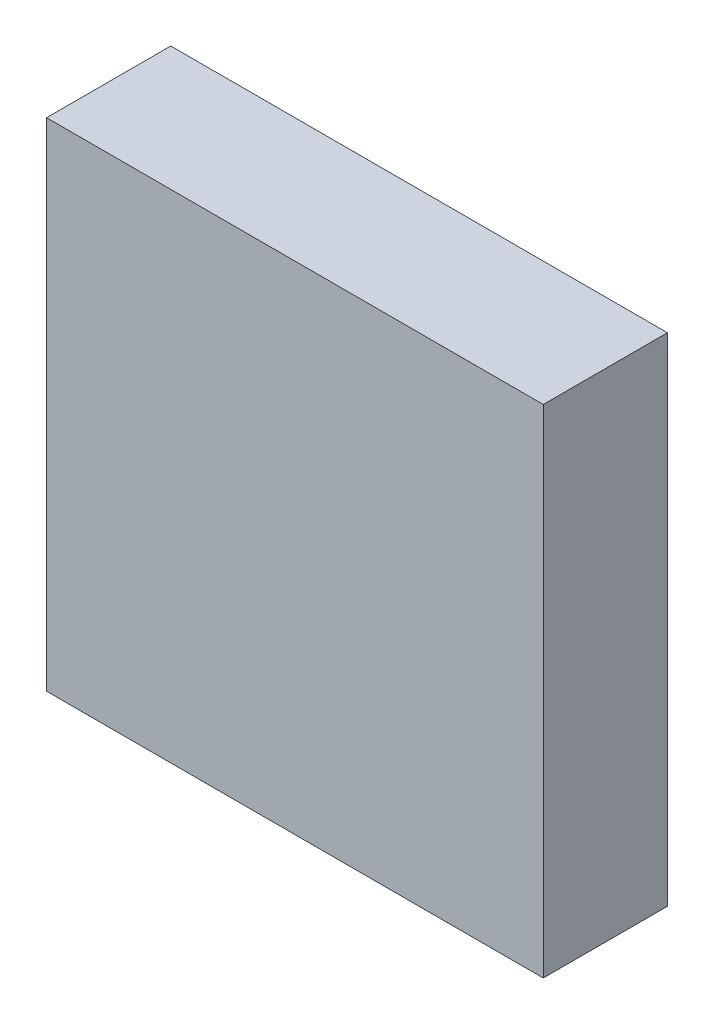
ISO-10303-21;
HEADER;
FILE_DESCRIPTION(('STEP AP214'),'2;1');
FILE_NAME('part.step','',(''),(''),'','','');
FILE_SCHEMA(('AUTOMOTIVE_DESIGN { 1 0 10303 214 1 1 1 1 }'));
ENDSEC;
DATA;
#1=APPLICATION_CONTEXT('core data for automotive mechanical design processes');
#2=APPLICATION_PROTOCOL_DEFINITION('international standard','automotive_design',2000,#1);
#3=PRODUCT_CONTEXT('',#1,'mechanical');
#4=PRODUCT('Part','Part','',(#3));
#5=PRODUCT_RELATED_PRODUCT_CATEGORY('part','',(#4));
#6=PRODUCT_DEFINITION_FORMATION('','',#4);
#7=PRODUCT_DEFINITION_CONTEXT('part definition',#1,'design');
#8=PRODUCT_DEFINITION('design','',#6,#7);
#9=PRODUCT_DEFINITION_SHAPE('','',#8);
#10=(LENGTH_UNIT() NAMED_UNIT(*) SI_UNIT(.MILLI.,.METRE.));
#11=(NAMED_UNIT(*) PLANE_ANGLE_UNIT() SI_UNIT($,.RADIAN.));
#12=(NAMED_UNIT(*) SI_UNIT($,.STERADIAN.) SOLID_ANGLE_UNIT());
#13=UNCERTAINTY_MEASURE_WITH_UNIT(LENGTH_MEASURE(1.E-05),#10,'distance_accuracy_value','');
#14=(GEOMETRIC_REPRESENTATION_CONTEXT(3) GLOBAL_UNCERTAINTY_ASSIGNED_CONTEXT((#13)) GLOBAL_UNIT_ASSIGNED_CONTEXT((#10,
#11,#12)) REPRESENTATION_CONTEXT('',''));
#15=CARTESIAN_POINT('',(0.,0.,0.));
#16=DIRECTION('',(0.,0.,1.));
#17=DIRECTION('',(1.,0.,0.));
#18=AXIS2_PLACEMENT_3D('',#15,#16,#17);
#19=CARTESIAN_POINT('',(-6.599999976687E-07,-6.599999976687E-07,1.15000024));
#20=DIRECTION('',(0.,0.,-1.));
#21=DIRECTION('',(-1.,0.,0.));
#22=AXIS2_PLACEMENT_3D('',#19,#20,#21);
#23=PLANE('',#22);
#24=DIRECTION('',(1.,0.,0.));
#25=VECTOR('',#24,1.);
#26=CARTESIAN_POINT('',(2.29999982,-2.30000114,1.15000024));
#27=LINE('',#26,#25);
#28=CARTESIAN_POINT('',(2.29999982,-2.30000114,1.15000024));
#29=VERTEX_POINT('',#28);
#30=CARTESIAN_POINT('',(-2.30000114,-2.30000114,1.15000024));
#31=VERTEX_POINT('',#30);
#32=EDGE_CURVE('E68',#29,#31,#27,.F.);
#33=ORIENTED_EDGE('',*,*,#32,.F.);
#34=DIRECTION('',(0.,1.,0.));
#35=VECTOR('',#34,1.);
#36=CARTESIAN_POINT('',(2.29999982,2.29999982,1.15000024));
#37=LINE('',#36,#35);
#38=CARTESIAN_POINT('',(2.29999982,2.29999982,1.15000024));
#39=VERTEX_POINT('',#38);
#40=EDGE_CURVE('E55',#39,#29,#37,.F.);
#41=ORIENTED_EDGE('',*,*,#40,.F.);
#42=DIRECTION('',(1.,0.,0.));
#43=VECTOR('',#42,1.);
#44=CARTESIAN_POINT('',(-2.30000114,2.29999982,1.15000024));
#45=LINE('',#44,#43);
#46=CARTESIAN_POINT('',(-2.30000114,2.29999982,1.15000024));
#47=VERTEX_POINT('',#46);
#48=EDGE_CURVE('E20',#47,#39,#45,.T.);
#49=ORIENTED_EDGE('',*,*,#48,.F.);
#50=DIRECTION('',(0.,1.,0.));
#51=VECTOR('',#50,1.);
#52=CARTESIAN_POINT('',(-2.30000114,-2.30000114,1.15000024));
#53=LINE('',#52,#51);
#54=EDGE_CURVE('E80',#31,#47,#53,.T.);
#55=ORIENTED_EDGE('',*,*,#54,.F.);
#56=EDGE_LOOP('',(#33,#41,#49,#55));
#57=FACE_BOUND('',#56,.T.);
#58=ADVANCED_FACE('F17',(#57),#23,.F.);
#59=CARTESIAN_POINT('',(-2.30000114,2.29999982,0.));
#60=DIRECTION('',(0.,1.,0.));
#61=DIRECTION('',(0.,0.,1.));
#62=AXIS2_PLACEMENT_3D('',#59,#60,#61);
#63=PLANE('',#62);
#64=DIRECTION('',(0.,0.,-1.));
#65=VECTOR('',#64,1.);
#66=CARTESIAN_POINT('',(2.29999982,2.29999982,0.));
#67=LINE('',#66,#65);
#68=CARTESIAN_POINT('',(2.29999982,2.29999982,0.));
#69=VERTEX_POINT('',#68);
#70=EDGE_CURVE('E61',#69,#39,#67,.F.);
#71=ORIENTED_EDGE('',*,*,#70,.F.);
#72=DIRECTION('',(-1.,0.,0.));
#73=VECTOR('',#72,1.);
#74=CARTESIAN_POINT('',(-6.599999976687E-07,2.29999982,0.));
#75=LINE('',#74,#73);
#76=CARTESIAN_POINT('',(-2.30000114,2.29999982,0.));
#77=VERTEX_POINT('',#76);
#78=EDGE_CURVE('E83',#77,#69,#75,.F.);
#79=ORIENTED_EDGE('',*,*,#78,.F.);
#80=DIRECTION('',(0.,0.,1.));
#81=VECTOR('',#80,1.);
#82=CARTESIAN_POINT('',(-2.30000114,2.29999982,0.));
#83=LINE('',#82,#81);
#84=EDGE_CURVE('E64',#47,#77,#83,.F.);
#85=ORIENTED_EDGE('',*,*,#84,.F.);
#86=ORIENTED_EDGE('',*,*,#48,.T.);
#87=EDGE_LOOP('',(#71,#79,#85,#86));
#88=FACE_BOUND('',#87,.T.);
#89=ADVANCED_FACE('F60',(#88),#63,.T.);
#90=CARTESIAN_POINT('',(2.29999982,2.29999982,0.));
#91=DIRECTION('',(1.,0.,0.));
#92=DIRECTION('',(0.,0.,-1.));
#93=AXIS2_PLACEMENT_3D('',#90,#91,#92);
#94=PLANE('',#93);
#95=DIRECTION('',(0.,0.,-1.));
#96=VECTOR('',#95,1.);
#97=CARTESIAN_POINT('',(2.29999982,-2.30000114,0.));
#98=LINE('',#97,#96);
#99=CARTESIAN_POINT('',(2.29999982,-2.30000114,0.));
#100=VERTEX_POINT('',#99);
#101=EDGE_CURVE('E70',#100,#29,#98,.F.);
#102=ORIENTED_EDGE('',*,*,#101,.F.);
#103=DIRECTION('',(0.,1.,0.));
#104=VECTOR('',#103,1.);
#105=CARTESIAN_POINT('',(2.29999982,-6.599999976687E-07,0.));
#106=LINE('',#105,#104);
#107=EDGE_CURVE('E74',#69,#100,#106,.F.);
#108=ORIENTED_EDGE('',*,*,#107,.F.);
#109=ORIENTED_EDGE('',*,*,#70,.T.);
#110=ORIENTED_EDGE('',*,*,#40,.T.);
#111=EDGE_LOOP('',(#102,#108,#109,#110));
#112=FACE_BOUND('',#111,.T.);
#113=ADVANCED_FACE('F72',(#112),#94,.T.);
#114=CARTESIAN_POINT('',(2.29999982,-2.30000114,0.));
#115=DIRECTION('',(0.,-1.,0.));
#116=DIRECTION('',(0.,0.,-1.));
#117=AXIS2_PLACEMENT_3D('',#114,#115,#116);
#118=PLANE('',#117);
#119=DIRECTION('',(0.,0.,1.));
#120=VECTOR('',#119,1.);
#121=CARTESIAN_POINT('',(-2.30000114,-2.30000114,0.));
#122=LINE('',#121,#120);
#123=CARTESIAN_POINT('',(-2.30000114,-2.30000114,0.));
#124=VERTEX_POINT('',#123);
#125=EDGE_CURVE('E35',#124,#31,#122,.T.);
#126=ORIENTED_EDGE('',*,*,#125,.F.);
#127=DIRECTION('',(-1.,0.,0.));
#128=VECTOR('',#127,1.);
#129=CARTESIAN_POINT('',(-6.599999976687E-07,-2.30000114,0.));
#130=LINE('',#129,#128);
#131=EDGE_CURVE('E26',#100,#124,#130,.T.);
#132=ORIENTED_EDGE('',*,*,#131,.F.);
#133=ORIENTED_EDGE('',*,*,#101,.T.);
#134=ORIENTED_EDGE('',*,*,#32,.T.);
#135=EDGE_LOOP('',(#126,#132,#133,#134));
#136=FACE_BOUND('',#135,.T.);
#137=ADVANCED_FACE('F89',(#136),#118,.T.);
#138=CARTESIAN_POINT('',(-2.30000114,-2.30000114,0.));
#139=DIRECTION('',(-1.,0.,0.));
#140=DIRECTION('',(0.,0.,1.));
#141=AXIS2_PLACEMENT_3D('',#138,#139,#140);
#142=PLANE('',#141);
#143=ORIENTED_EDGE('',*,*,#84,.T.);
#144=DIRECTION('',(0.,1.,0.));
#145=VECTOR('',#144,1.);
#146=CARTESIAN_POINT('',(-2.30000114,-6.599999976687E-07,0.));
#147=LINE('',#146,#145);
#148=EDGE_CURVE('E11',#124,#77,#147,.T.);
#149=ORIENTED_EDGE('',*,*,#148,.F.);
#150=ORIENTED_EDGE('',*,*,#125,.T.);
#151=ORIENTED_EDGE('',*,*,#54,.T.);
#152=EDGE_LOOP('',(#143,#149,#150,#151));
#153=FACE_BOUND('',#152,.T.);
#154=ADVANCED_FACE('F91',(#153),#142,.T.);
#155=CARTESIAN_POINT('',(-6.599999976687E-07,-6.599999976687E-07,0.));
#156=DIRECTION('',(0.,0.,-1.));
#157=DIRECTION('',(-1.,0.,0.));
#158=AXIS2_PLACEMENT_3D('',#155,#156,#157);
#159=PLANE('',#158);
#160=ORIENTED_EDGE('',*,*,#131,.T.);
#161=ORIENTED_EDGE('',*,*,#148,.T.);
#162=ORIENTED_EDGE('',*,*,#78,.T.);
#163=ORIENTED_EDGE('',*,*,#107,.T.);
#164=EDGE_LOOP('',(#160,#161,#162,#163));
#165=FACE_BOUND('',#164,.T.);
#166=ADVANCED_FACE('F88',(#165),#159,.T.);
#167=CLOSED_SHELL('',(#58,#89,#113,#137,#154,#166));
#168=MANIFOLD_SOLID_BREP('B1',#167);
#169=ADVANCED_BREP_SHAPE_REPRESENTATION('',(#18,#168),#14);
#170=SHAPE_DEFINITION_REPRESENTATION(#9,#169);
ENDSEC;
END-ISO-10303-21;
